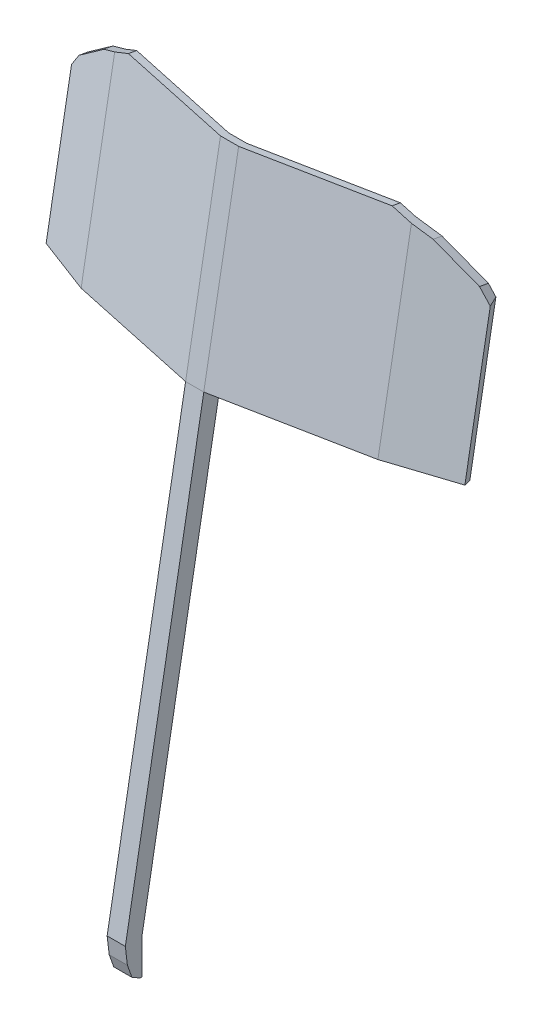
ISO-10303-21;
HEADER;
FILE_DESCRIPTION(('STEP AP214'),'2;1');
FILE_NAME('part.step','',(''),(''),'','','');
FILE_SCHEMA(('AUTOMOTIVE_DESIGN { 1 0 10303 214 1 1 1 1 }'));
ENDSEC;
DATA;
#1=APPLICATION_CONTEXT('core data for automotive mechanical design processes');
#2=APPLICATION_PROTOCOL_DEFINITION('international standard','automotive_design',2000,#1);
#3=PRODUCT_CONTEXT('',#1,'mechanical');
#4=PRODUCT('Part','Part','',(#3));
#5=PRODUCT_RELATED_PRODUCT_CATEGORY('part','',(#4));
#6=PRODUCT_DEFINITION_FORMATION('','',#4);
#7=PRODUCT_DEFINITION_CONTEXT('part definition',#1,'design');
#8=PRODUCT_DEFINITION('design','',#6,#7);
#9=PRODUCT_DEFINITION_SHAPE('','',#8);
#10=(LENGTH_UNIT() NAMED_UNIT(*) SI_UNIT(.MILLI.,.METRE.));
#11=(NAMED_UNIT(*) PLANE_ANGLE_UNIT() SI_UNIT($,.RADIAN.));
#12=(NAMED_UNIT(*) SI_UNIT($,.STERADIAN.) SOLID_ANGLE_UNIT());
#13=UNCERTAINTY_MEASURE_WITH_UNIT(LENGTH_MEASURE(1.E-05),#10,'distance_accuracy_value','');
#14=(GEOMETRIC_REPRESENTATION_CONTEXT(3) GLOBAL_UNCERTAINTY_ASSIGNED_CONTEXT((#13)) GLOBAL_UNIT_ASSIGNED_CONTEXT((#10,
#11,#12)) REPRESENTATION_CONTEXT('',''));
#15=CARTESIAN_POINT('',(0.,0.,0.));
#16=DIRECTION('',(0.,0.,1.));
#17=DIRECTION('',(1.,0.,0.));
#18=AXIS2_PLACEMENT_3D('',#15,#16,#17);
#19=CARTESIAN_POINT('',(-5.5,275.31648299456,-47.2745792244531));
#20=DIRECTION('',(0.,0.984436631052606,-0.175739919886731));
#21=DIRECTION('',(0.,0.175739919886731,0.984436631052606));
#22=AXIS2_PLACEMENT_3D('',#19,#20,#21);
#23=PLANE('',#22);
#24=DIRECTION('',(0.,0.175739919886731,0.984436631052606));
#25=VECTOR('',#24,1.);
#26=CARTESIAN_POINT('',(-5.5,275.31648299456,-47.2745792244531));
#27=LINE('',#26,#25);
#28=CARTESIAN_POINT('',(-5.5,275.31648299456,-47.2745792244531));
#29=VERTEX_POINT('',#28);
#30=CARTESIAN_POINT('',(-5.49999999999999,276.195182593994,-42.3523960691901));
#31=VERTEX_POINT('',#30);
#32=EDGE_CURVE('E384',#29,#31,#27,.T.);
#33=ORIENTED_EDGE('',*,*,#32,.T.);
#34=DIRECTION('',(1.,0.,0.));
#35=VECTOR('',#34,1.);
#36=CARTESIAN_POINT('',(-5.49999999999999,276.195182593994,-42.3523960691901));
#37=LINE('',#36,#35);
#38=CARTESIAN_POINT('',(5.5,276.195182593994,-42.3523960691901));
#39=VERTEX_POINT('',#38);
#40=EDGE_CURVE('E307',#31,#39,#37,.T.);
#41=ORIENTED_EDGE('',*,*,#40,.T.);
#42=DIRECTION('',(0.,0.175739919886731,0.984436631052606));
#43=VECTOR('',#42,1.);
#44=CARTESIAN_POINT('',(5.5,275.31648299456,-47.2745792244531));
#45=LINE('',#44,#43);
#46=CARTESIAN_POINT('',(5.5,275.31648299456,-47.2745792244531));
#47=VERTEX_POINT('',#46);
#48=EDGE_CURVE('E371',#47,#39,#45,.T.);
#49=ORIENTED_EDGE('',*,*,#48,.F.);
#50=DIRECTION('',(1.,0.,0.));
#51=VECTOR('',#50,1.);
#52=CARTESIAN_POINT('',(-5.5,275.31648299456,-47.2745792244531));
#53=LINE('',#52,#51);
#54=EDGE_CURVE('E392',#29,#47,#53,.T.);
#55=ORIENTED_EDGE('',*,*,#54,.F.);
#56=EDGE_LOOP('',(#33,#41,#49,#55));
#57=FACE_BOUND('',#56,.T.);
#58=ADVANCED_FACE('F47',(#57),#23,.T.);
#59=CARTESIAN_POINT('',(5.5,10.5,10.));
#60=DIRECTION('',(-1.,0.,0.));
#61=DIRECTION('',(0.,-1.,0.));
#62=AXIS2_PLACEMENT_3D('',#59,#60,#61);
#63=PLANE('',#62);
#64=DIRECTION('',(0.,0.993027798842381,0.117880408576895));
#65=VECTOR('',#64,1.);
#66=CARTESIAN_POINT('',(5.5,10.5,10.));
#67=LINE('',#66,#65);
#68=CARTESIAN_POINT('',(5.5,0.,8.75356531660011));
#69=VERTEX_POINT('',#68);
#70=CARTESIAN_POINT('',(5.5,10.5,10.));
#71=VERTEX_POINT('',#70);
#72=EDGE_CURVE('E410',#69,#71,#67,.T.);
#73=ORIENTED_EDGE('',*,*,#72,.F.);
#74=DIRECTION('',(0.,0.941962933262502,0.335716893169681));
#75=VECTOR('',#74,1.);
#76=CARTESIAN_POINT('',(5.5,9.71075237672118,12.2144909041513));
#77=LINE('',#76,#75);
#78=CARTESIAN_POINT('',(5.5,-7.69347784749952,6.01159916333903));
#79=VERTEX_POINT('',#78);
#80=EDGE_CURVE('E419',#79,#69,#77,.T.);
#81=ORIENTED_EDGE('',*,*,#80,.F.);
#82=DIRECTION('',(0.,0.495114424059408,0.868827777576385));
#83=VECTOR('',#82,1.);
#84=CARTESIAN_POINT('',(5.5,-1.51787268943564,16.8485633961284));
#85=LINE('',#84,#83);
#86=CARTESIAN_POINT('',(5.5,-10.5,1.08670849971477));
#87=VERTEX_POINT('',#86);
#88=EDGE_CURVE('E416',#87,#79,#85,.T.);
#89=ORIENTED_EDGE('',*,*,#88,.F.);
#90=DIRECTION('',(0.,0.,-1.));
#91=VECTOR('',#90,1.);
#92=CARTESIAN_POINT('',(5.5,-10.5,10.));
#93=LINE('',#92,#91);
#94=CARTESIAN_POINT('',(5.5,-10.5,0.));
#95=VERTEX_POINT('',#94);
#96=EDGE_CURVE('E466',#87,#95,#93,.T.);
#97=ORIENTED_EDGE('',*,*,#96,.T.);
#98=DIRECTION('',(0.,1.,0.));
#99=VECTOR('',#98,1.);
#100=CARTESIAN_POINT('',(5.5,10.5,0.));
#101=LINE('',#100,#99);
#102=CARTESIAN_POINT('',(5.5,10.5,0.));
#103=VERTEX_POINT('',#102);
#104=EDGE_CURVE('E462',#95,#103,#101,.T.);
#105=ORIENTED_EDGE('',*,*,#104,.T.);
#106=DIRECTION('',(0.,0.984436631052606,-0.175739919886732));
#107=VECTOR('',#106,1.);
#108=CARTESIAN_POINT('',(5.5,10.5,0.));
#109=LINE('',#108,#107);
#110=EDGE_CURVE('E366',#103,#47,#109,.T.);
#111=ORIENTED_EDGE('',*,*,#110,.T.);
#112=ORIENTED_EDGE('',*,*,#48,.T.);
#113=CARTESIAN_POINT('',(5.5,277.073882193427,-37.4302129139271));
#114=VERTEX_POINT('',#113);
#115=EDGE_CURVE('E370',#39,#114,#45,.T.);
#116=ORIENTED_EDGE('',*,*,#115,.T.);
#117=DIRECTION('',(0.,-0.984537484082691,0.175174034708699));
#118=VECTOR('',#117,1.);
#119=CARTESIAN_POINT('',(5.5,10.5,10.));
#120=LINE('',#119,#118);
#121=EDGE_CURVE('E375',#114,#71,#120,.T.);
#122=ORIENTED_EDGE('',*,*,#121,.T.);
#123=EDGE_LOOP('',(#73,#81,#89,#97,#105,#111,#112,#116,#122));
#124=FACE_BOUND('',#123,.T.);
#125=ADVANCED_FACE('F49',(#124),#63,.F.);
#126=CARTESIAN_POINT('',(-5.5,-10.5,10.));
#127=DIRECTION('',(1.,0.,0.));
#128=DIRECTION('',(0.,1.,0.));
#129=AXIS2_PLACEMENT_3D('',#126,#127,#128);
#130=PLANE('',#129);
#131=DIRECTION('',(0.,-0.993027798842381,-0.117880408576895));
#132=VECTOR('',#131,1.);
#133=CARTESIAN_POINT('',(-5.5,-10.2081883947486,7.54177102422916));
#134=LINE('',#133,#132);
#135=CARTESIAN_POINT('',(-5.5,10.5,10.));
#136=VERTEX_POINT('',#135);
#137=CARTESIAN_POINT('',(-5.5,0.,8.75356531660011));
#138=VERTEX_POINT('',#137);
#139=EDGE_CURVE('E407',#136,#138,#134,.T.);
#140=ORIENTED_EDGE('',*,*,#139,.F.);
#141=DIRECTION('',(0.,-0.984537484082691,0.175174034708699));
#142=VECTOR('',#141,1.);
#143=CARTESIAN_POINT('',(-5.5,10.5,10.));
#144=LINE('',#143,#142);
#145=CARTESIAN_POINT('',(-5.49999999999999,277.073882193427,-37.4302129139271));
#146=VERTEX_POINT('',#145);
#147=EDGE_CURVE('E388',#146,#136,#144,.T.);
#148=ORIENTED_EDGE('',*,*,#147,.F.);
#149=EDGE_CURVE('E383',#31,#146,#27,.T.);
#150=ORIENTED_EDGE('',*,*,#149,.F.);
#151=ORIENTED_EDGE('',*,*,#32,.F.);
#152=DIRECTION('',(0.,0.984436631052606,-0.175739919886732));
#153=VECTOR('',#152,1.);
#154=CARTESIAN_POINT('',(-5.5,10.5,0.));
#155=LINE('',#154,#153);
#156=CARTESIAN_POINT('',(-5.5,10.5,0.));
#157=VERTEX_POINT('',#156);
#158=EDGE_CURVE('E379',#157,#29,#155,.T.);
#159=ORIENTED_EDGE('',*,*,#158,.F.);
#160=DIRECTION('',(0.,-1.,0.));
#161=VECTOR('',#160,1.);
#162=CARTESIAN_POINT('',(-5.5,-10.5,0.));
#163=LINE('',#162,#161);
#164=CARTESIAN_POINT('',(-5.5,-10.5,0.));
#165=VERTEX_POINT('',#164);
#166=EDGE_CURVE('E474',#157,#165,#163,.T.);
#167=ORIENTED_EDGE('',*,*,#166,.T.);
#168=DIRECTION('',(0.,0.,-1.));
#169=VECTOR('',#168,1.);
#170=CARTESIAN_POINT('',(-5.5,-10.5,10.));
#171=LINE('',#170,#169);
#172=CARTESIAN_POINT('',(-5.5,-10.5,1.08670849971477));
#173=VERTEX_POINT('',#172);
#174=EDGE_CURVE('E483',#173,#165,#171,.T.);
#175=ORIENTED_EDGE('',*,*,#174,.F.);
#176=DIRECTION('',(0.,-0.495114424059408,-0.868827777576385));
#177=VECTOR('',#176,1.);
#178=CARTESIAN_POINT('',(-5.5,-6.6657768405809,7.8150109373959));
#179=LINE('',#178,#177);
#180=CARTESIAN_POINT('',(-5.5,-7.69347784749952,6.01159916333903));
#181=VERTEX_POINT('',#180);
#182=EDGE_CURVE('E413',#181,#173,#179,.T.);
#183=ORIENTED_EDGE('',*,*,#182,.F.);
#184=DIRECTION('',(0.,-0.941962933262502,-0.335716893169681));
#185=VECTOR('',#184,1.);
#186=CARTESIAN_POINT('',(-5.5,-8.92242514372926,5.57360064599764));
#187=LINE('',#186,#185);
#188=EDGE_CURVE('E246',#138,#181,#187,.T.);
#189=ORIENTED_EDGE('',*,*,#188,.F.);
#190=EDGE_LOOP('',(#140,#148,#150,#151,#159,#167,#175,#183,#189));
#191=FACE_BOUND('',#190,.T.);
#192=ADVANCED_FACE('F633',(#191),#130,.F.);
#193=CARTESIAN_POINT('',(5.5,-10.5,10.));
#194=DIRECTION('',(0.,1.,0.));
#195=DIRECTION('',(0.,0.,1.));
#196=AXIS2_PLACEMENT_3D('',#193,#194,#195);
#197=PLANE('',#196);
#198=DIRECTION('',(1.,0.,0.));
#199=VECTOR('',#198,1.);
#200=CARTESIAN_POINT('',(5.5,-10.5,1.08670849971477));
#201=LINE('',#200,#199);
#202=EDGE_CURVE('E486',#173,#87,#201,.T.);
#203=ORIENTED_EDGE('',*,*,#202,.F.);
#204=ORIENTED_EDGE('',*,*,#174,.T.);
#205=DIRECTION('',(1.,0.,0.));
#206=VECTOR('',#205,1.);
#207=CARTESIAN_POINT('',(5.5,-10.5,0.));
#208=LINE('',#207,#206);
#209=EDGE_CURVE('E467',#165,#95,#208,.T.);
#210=ORIENTED_EDGE('',*,*,#209,.T.);
#211=ORIENTED_EDGE('',*,*,#96,.F.);
#212=EDGE_LOOP('',(#203,#204,#210,#211));
#213=FACE_BOUND('',#212,.T.);
#214=ADVANCED_FACE('F646',(#213),#197,.F.);
#215=CARTESIAN_POINT('',(0.,0.,0.));
#216=DIRECTION('',(0.,0.,-1.));
#217=DIRECTION('',(-1.,0.,0.));
#218=AXIS2_PLACEMENT_3D('',#215,#216,#217);
#219=PLANE('',#218);
#220=ORIENTED_EDGE('',*,*,#104,.F.);
#221=ORIENTED_EDGE('',*,*,#209,.F.);
#222=ORIENTED_EDGE('',*,*,#166,.F.);
#223=DIRECTION('',(-1.,0.,0.));
#224=VECTOR('',#223,1.);
#225=CARTESIAN_POINT('',(-5.5,10.5,0.));
#226=LINE('',#225,#224);
#227=EDGE_CURVE('E470',#103,#157,#226,.T.);
#228=ORIENTED_EDGE('',*,*,#227,.F.);
#229=EDGE_LOOP('',(#220,#221,#222,#228));
#230=FACE_BOUND('',#229,.T.);
#231=DIRECTION('',(0.,1.,0.));
#232=VECTOR('',#231,1.);
#233=CARTESIAN_POINT('',(2.,-1.5,0.));
#234=LINE('',#233,#232);
#235=CARTESIAN_POINT('',(2.,-1.5,0.));
#236=VERTEX_POINT('',#235);
#237=CARTESIAN_POINT('',(2.,1.5,0.));
#238=VERTEX_POINT('',#237);
#239=EDGE_CURVE('E427',#236,#238,#234,.T.);
#240=ORIENTED_EDGE('',*,*,#239,.T.);
#241=DIRECTION('',(-1.,0.,0.));
#242=VECTOR('',#241,1.);
#243=CARTESIAN_POINT('',(0.,1.5,0.));
#244=LINE('',#243,#242);
#245=CARTESIAN_POINT('',(-2.,1.5,0.));
#246=VERTEX_POINT('',#245);
#247=EDGE_CURVE('E422',#238,#246,#244,.T.);
#248=ORIENTED_EDGE('',*,*,#247,.T.);
#249=DIRECTION('',(0.,-1.,0.));
#250=VECTOR('',#249,1.);
#251=CARTESIAN_POINT('',(-2.,1.5,0.));
#252=LINE('',#251,#250);
#253=CARTESIAN_POINT('',(-2.,-1.5,0.));
#254=VERTEX_POINT('',#253);
#255=EDGE_CURVE('E440',#246,#254,#252,.T.);
#256=ORIENTED_EDGE('',*,*,#255,.T.);
#257=DIRECTION('',(1.,0.,0.));
#258=VECTOR('',#257,1.);
#259=CARTESIAN_POINT('',(-2.,-1.5,0.));
#260=LINE('',#259,#258);
#261=EDGE_CURVE('E444',#254,#236,#260,.T.);
#262=ORIENTED_EDGE('',*,*,#261,.T.);
#263=EDGE_LOOP('',(#240,#248,#256,#262));
#264=FACE_BOUND('',#263,.T.);
#265=ADVANCED_FACE('F651',(#230,#264),#219,.T.);
#266=CARTESIAN_POINT('',(0.,1.5,8.));
#267=DIRECTION('',(0.,-1.,0.));
#268=DIRECTION('',(1.,0.,0.));
#269=AXIS2_PLACEMENT_3D('',#266,#267,#268);
#270=PLANE('',#269);
#271=ORIENTED_EDGE('',*,*,#247,.F.);
#272=DIRECTION('',(0.,0.,-1.));
#273=VECTOR('',#272,1.);
#274=CARTESIAN_POINT('',(2.,1.5,8.));
#275=LINE('',#274,#273);
#276=CARTESIAN_POINT('',(2.,1.5,8.));
#277=VERTEX_POINT('',#276);
#278=EDGE_CURVE('E436',#277,#238,#275,.T.);
#279=ORIENTED_EDGE('',*,*,#278,.F.);
#280=DIRECTION('',(-1.,0.,0.));
#281=VECTOR('',#280,1.);
#282=CARTESIAN_POINT('',(2.,1.5,8.));
#283=LINE('',#282,#281);
#284=CARTESIAN_POINT('',(-2.,1.5,8.));
#285=VERTEX_POINT('',#284);
#286=EDGE_CURVE('E423',#277,#285,#283,.T.);
#287=ORIENTED_EDGE('',*,*,#286,.T.);
#288=DIRECTION('',(0.,0.,-1.));
#289=VECTOR('',#288,1.);
#290=CARTESIAN_POINT('',(-2.,1.5,8.));
#291=LINE('',#290,#289);
#292=EDGE_CURVE('E459',#285,#246,#291,.T.);
#293=ORIENTED_EDGE('',*,*,#292,.T.);
#294=EDGE_LOOP('',(#271,#279,#287,#293));
#295=FACE_BOUND('',#294,.T.);
#296=ADVANCED_FACE('F915',(#295),#270,.T.);
#297=CARTESIAN_POINT('',(-2.,1.5,8.));
#298=DIRECTION('',(1.,0.,0.));
#299=DIRECTION('',(0.,1.,0.));
#300=AXIS2_PLACEMENT_3D('',#297,#298,#299);
#301=PLANE('',#300);
#302=ORIENTED_EDGE('',*,*,#255,.F.);
#303=ORIENTED_EDGE('',*,*,#292,.F.);
#304=DIRECTION('',(0.,-1.,0.));
#305=VECTOR('',#304,1.);
#306=CARTESIAN_POINT('',(-2.,1.5,8.));
#307=LINE('',#306,#305);
#308=CARTESIAN_POINT('',(-2.,-1.5,8.));
#309=VERTEX_POINT('',#308);
#310=EDGE_CURVE('E426',#285,#309,#307,.T.);
#311=ORIENTED_EDGE('',*,*,#310,.T.);
#312=DIRECTION('',(0.,0.,-1.));
#313=VECTOR('',#312,1.);
#314=CARTESIAN_POINT('',(-2.,-1.5,8.));
#315=LINE('',#314,#313);
#316=EDGE_CURVE('E456',#309,#254,#315,.T.);
#317=ORIENTED_EDGE('',*,*,#316,.T.);
#318=EDGE_LOOP('',(#302,#303,#311,#317));
#319=FACE_BOUND('',#318,.T.);
#320=ADVANCED_FACE('F906',(#319),#301,.T.);
#321=CARTESIAN_POINT('',(-2.,-1.5,8.));
#322=DIRECTION('',(0.,1.,0.));
#323=DIRECTION('',(0.,0.,1.));
#324=AXIS2_PLACEMENT_3D('',#321,#322,#323);
#325=PLANE('',#324);
#326=ORIENTED_EDGE('',*,*,#261,.F.);
#327=ORIENTED_EDGE('',*,*,#316,.F.);
#328=DIRECTION('',(1.,0.,0.));
#329=VECTOR('',#328,1.);
#330=CARTESIAN_POINT('',(-2.,-1.5,8.));
#331=LINE('',#330,#329);
#332=CARTESIAN_POINT('',(2.,-1.5,8.));
#333=VERTEX_POINT('',#332);
#334=EDGE_CURVE('E430',#309,#333,#331,.T.);
#335=ORIENTED_EDGE('',*,*,#334,.T.);
#336=DIRECTION('',(0.,0.,-1.));
#337=VECTOR('',#336,1.);
#338=CARTESIAN_POINT('',(2.,-1.5,8.));
#339=LINE('',#338,#337);
#340=EDGE_CURVE('E453',#333,#236,#339,.T.);
#341=ORIENTED_EDGE('',*,*,#340,.T.);
#342=EDGE_LOOP('',(#326,#327,#335,#341));
#343=FACE_BOUND('',#342,.T.);
#344=ADVANCED_FACE('F897',(#343),#325,.T.);
#345=CARTESIAN_POINT('',(2.,-1.5,8.));
#346=DIRECTION('',(-1.,0.,0.));
#347=DIRECTION('',(0.,-1.,0.));
#348=AXIS2_PLACEMENT_3D('',#345,#346,#347);
#349=PLANE('',#348);
#350=ORIENTED_EDGE('',*,*,#239,.F.);
#351=ORIENTED_EDGE('',*,*,#340,.F.);
#352=DIRECTION('',(0.,1.,0.));
#353=VECTOR('',#352,1.);
#354=CARTESIAN_POINT('',(2.,-1.5,8.));
#355=LINE('',#354,#353);
#356=EDGE_CURVE('E433',#333,#277,#355,.T.);
#357=ORIENTED_EDGE('',*,*,#356,.T.);
#358=ORIENTED_EDGE('',*,*,#278,.T.);
#359=EDGE_LOOP('',(#350,#351,#357,#358));
#360=FACE_BOUND('',#359,.T.);
#361=ADVANCED_FACE('F888',(#360),#349,.T.);
#362=CARTESIAN_POINT('',(0.,0.,8.));
#363=DIRECTION('',(0.,0.,1.));
#364=DIRECTION('',(1.,0.,0.));
#365=AXIS2_PLACEMENT_3D('',#362,#363,#364);
#366=PLANE('',#365);
#367=ORIENTED_EDGE('',*,*,#286,.F.);
#368=ORIENTED_EDGE('',*,*,#356,.F.);
#369=ORIENTED_EDGE('',*,*,#334,.F.);
#370=ORIENTED_EDGE('',*,*,#310,.F.);
#371=EDGE_LOOP('',(#367,#368,#369,#370));
#372=FACE_BOUND('',#371,.T.);
#373=ADVANCED_FACE('F858',(#372),#366,.F.);
#374=CARTESIAN_POINT('',(8.,-7.69347784749952,6.01159916333903));
#375=DIRECTION('',(0.,-0.335716893169681,0.941962933262502));
#376=DIRECTION('',(0.,-0.941962933262502,-0.335716893169681));
#377=AXIS2_PLACEMENT_3D('',#374,#375,#376);
#378=PLANE('',#377);
#379=ORIENTED_EDGE('',*,*,#80,.T.);
#380=DIRECTION('',(-1.,0.,0.));
#381=VECTOR('',#380,1.);
#382=CARTESIAN_POINT('',(8.,0.,8.75356531660011));
#383=LINE('',#382,#381);
#384=EDGE_CURVE('E397',#69,#138,#383,.T.);
#385=ORIENTED_EDGE('',*,*,#384,.T.);
#386=ORIENTED_EDGE('',*,*,#188,.T.);
#387=DIRECTION('',(-1.,0.,0.));
#388=VECTOR('',#387,1.);
#389=CARTESIAN_POINT('',(8.,-7.69347784749952,6.01159916333903));
#390=LINE('',#389,#388);
#391=EDGE_CURVE('E403',#79,#181,#390,.T.);
#392=ORIENTED_EDGE('',*,*,#391,.F.);
#393=EDGE_LOOP('',(#379,#385,#386,#392));
#394=FACE_BOUND('',#393,.T.);
#395=ADVANCED_FACE('F638',(#394),#378,.T.);
#396=CARTESIAN_POINT('',(8.,-10.5,1.08670849971477));
#397=DIRECTION('',(0.,-0.868827777576385,0.495114424059408));
#398=DIRECTION('',(0.,-0.495114424059408,-0.868827777576385));
#399=AXIS2_PLACEMENT_3D('',#396,#397,#398);
#400=PLANE('',#399);
#401=ORIENTED_EDGE('',*,*,#88,.T.);
#402=ORIENTED_EDGE('',*,*,#391,.T.);
#403=ORIENTED_EDGE('',*,*,#182,.T.);
#404=ORIENTED_EDGE('',*,*,#202,.T.);
#405=EDGE_LOOP('',(#401,#402,#403,#404));
#406=FACE_BOUND('',#405,.T.);
#407=ADVANCED_FACE('F641',(#406),#400,.T.);
#408=CARTESIAN_POINT('',(8.,0.,8.75356531660011));
#409=DIRECTION('',(0.,-0.117880408576895,0.993027798842381));
#410=DIRECTION('',(0.,-0.993027798842381,-0.117880408576895));
#411=AXIS2_PLACEMENT_3D('',#408,#409,#410);
#412=PLANE('',#411);
#413=ORIENTED_EDGE('',*,*,#72,.T.);
#414=DIRECTION('',(-1.,0.,0.));
#415=VECTOR('',#414,1.);
#416=CARTESIAN_POINT('',(-5.5,10.5,10.));
#417=LINE('',#416,#415);
#418=EDGE_CURVE('E463',#71,#136,#417,.T.);
#419=ORIENTED_EDGE('',*,*,#418,.T.);
#420=ORIENTED_EDGE('',*,*,#139,.T.);
#421=ORIENTED_EDGE('',*,*,#384,.F.);
#422=EDGE_LOOP('',(#413,#419,#420,#421));
#423=FACE_BOUND('',#422,.T.);
#424=ADVANCED_FACE('F629',(#423),#412,.T.);
#425=CARTESIAN_POINT('',(-5.5,10.5,10.));
#426=DIRECTION('',(0.,0.175174034708699,0.984537484082691));
#427=DIRECTION('',(0.,-0.984537484082691,0.175174034708699));
#428=AXIS2_PLACEMENT_3D('',#425,#426,#427);
#429=PLANE('',#428);
#430=ORIENTED_EDGE('',*,*,#418,.F.);
#431=ORIENTED_EDGE('',*,*,#121,.F.);
#432=DIRECTION('',(1.,0.,0.));
#433=VECTOR('',#432,1.);
#434=CARTESIAN_POINT('',(-5.5,277.073882193427,-37.4302129139271));
#435=LINE('',#434,#433);
#436=EDGE_CURVE('E393',#146,#114,#435,.T.);
#437=ORIENTED_EDGE('',*,*,#436,.F.);
#438=ORIENTED_EDGE('',*,*,#147,.T.);
#439=EDGE_LOOP('',(#430,#431,#437,#438));
#440=FACE_BOUND('',#439,.T.);
#441=ADVANCED_FACE('F626',(#440),#429,.T.);
#442=CARTESIAN_POINT('',(-5.5,10.5,0.));
#443=DIRECTION('',(0.,-0.175739919886732,-0.984436631052606));
#444=DIRECTION('',(0.,0.984436631052606,-0.175739919886732));
#445=AXIS2_PLACEMENT_3D('',#442,#443,#444);
#446=PLANE('',#445);
#447=ORIENTED_EDGE('',*,*,#54,.T.);
#448=ORIENTED_EDGE('',*,*,#110,.F.);
#449=ORIENTED_EDGE('',*,*,#227,.T.);
#450=ORIENTED_EDGE('',*,*,#158,.T.);
#451=EDGE_LOOP('',(#447,#448,#449,#450));
#452=FACE_BOUND('',#451,.T.);
#453=ADVANCED_FACE('F658',(#452),#446,.T.);
#454=CARTESIAN_POINT('',(0.,274.992195540421,-49.091129778537));
#455=DIRECTION('',(0.,0.984436631052607,-0.175739919886729));
#456=DIRECTION('',(0.,0.175739919886729,0.984436631052607));
#457=AXIS2_PLACEMENT_3D('',#454,#455,#456);
#458=PLANE('',#457);
#459=DIRECTION('',(-0.969016833125615,-0.0434068271152302,-0.243150620971842));
#460=VECTOR('',#459,1.);
#461=CARTESIAN_POINT('',(-5.49999999999999,276.195182593994,-42.3523960691901));
#462=LINE('',#461,#460);
#463=CARTESIAN_POINT('',(-87.6520205536125,272.515206734508,-62.9663979408304));
#464=VERTEX_POINT('',#463);
#465=EDGE_CURVE('E311',#31,#464,#462,.T.);
#466=ORIENTED_EDGE('',*,*,#465,.F.);
#467=ORIENTED_EDGE('',*,*,#149,.T.);
#468=DIRECTION('',(-0.969233859352783,-0.0432569188565593,-0.242310884722799));
#469=VECTOR('',#468,1.);
#470=CARTESIAN_POINT('',(-5.49999999999999,277.073882193427,-37.4302129139271));
#471=LINE('',#470,#469);
#472=CARTESIAN_POINT('',(-89.7224246344539,273.315034364124,-58.4860293505314));
#473=VERTEX_POINT('',#472);
#474=EDGE_CURVE('E271',#146,#473,#471,.T.);
#475=ORIENTED_EDGE('',*,*,#474,.T.);
#476=DIRECTION('',(0.917702741985329,0.0698158052487646,0.391084940505354));
#477=VECTOR('',#476,1.);
#478=CARTESIAN_POINT('',(-126.598918960081,270.509592004297,-74.2011851734115));
#479=LINE('',#478,#477);
#480=CARTESIAN_POINT('',(-126.598918960081,270.509592004297,-74.2011851734115));
#481=VERTEX_POINT('',#480);
#482=EDGE_CURVE('E323',#481,#473,#479,.T.);
#483=ORIENTED_EDGE('',*,*,#482,.F.);
#484=DIRECTION('',(0.331880735474261,-0.165779219226783,-0.928640095997164));
#485=VECTOR('',#484,1.);
#486=CARTESIAN_POINT('',(-126.598918960081,270.509592004297,-74.2011851734115));
#487=LINE('',#486,#485);
#488=CARTESIAN_POINT('',(-124.938057952393,269.679967950629,-78.848463429598));
#489=VERTEX_POINT('',#488);
#490=EDGE_CURVE('E319',#481,#489,#487,.T.);
#491=ORIENTED_EDGE('',*,*,#490,.T.);
#492=DIRECTION('',(0.917772186758867,0.0697876063051302,0.390926979393911));
#493=VECTOR('',#492,1.);
#494=CARTESIAN_POINT('',(-124.938057952393,269.679967950629,-78.848463429598));
#495=LINE('',#494,#493);
#496=EDGE_CURVE('E315',#489,#464,#495,.T.);
#497=ORIENTED_EDGE('',*,*,#496,.T.);
#498=EDGE_LOOP('',(#466,#467,#475,#483,#491,#497));
#499=FACE_BOUND('',#498,.T.);
#500=ADVANCED_FACE('F660',(#499),#458,.F.);
#501=CARTESIAN_POINT('',(-5.49999999999999,395.20627791974,-58.5190033003347));
#502=DIRECTION('',(0.,-0.175739919886731,-0.984436631052606));
#503=DIRECTION('',(0.,0.984436631052606,-0.175739919886731));
#504=AXIS2_PLACEMENT_3D('',#501,#502,#503);
#505=PLANE('',#504);
#506=ORIENTED_EDGE('',*,*,#436,.T.);
#507=DIRECTION('',(0.,-0.984436631052606,0.175739919886731));
#508=VECTOR('',#507,1.);
#509=CARTESIAN_POINT('',(5.5,395.20627791974,-58.5190033003347));
#510=LINE('',#509,#508);
#511=CARTESIAN_POINT('',(5.5,395.20627791974,-58.5190033003347));
#512=VERTEX_POINT('',#511);
#513=EDGE_CURVE('E363',#512,#114,#510,.T.);
#514=ORIENTED_EDGE('',*,*,#513,.F.);
#515=DIRECTION('',(1.,0.,0.));
#516=VECTOR('',#515,1.);
#517=CARTESIAN_POINT('',(-5.49999999999999,395.20627791974,-58.5190033003347));
#518=LINE('',#517,#516);
#519=CARTESIAN_POINT('',(-5.49999999999999,395.20627791974,-58.5190033003347));
#520=VERTEX_POINT('',#519);
#521=EDGE_CURVE('E262',#520,#512,#518,.T.);
#522=ORIENTED_EDGE('',*,*,#521,.F.);
#523=DIRECTION('',(0.,-0.984436631052606,0.175739919886731));
#524=VECTOR('',#523,1.);
#525=CARTESIAN_POINT('',(-5.49999999999999,395.20627791974,-58.5190033003347));
#526=LINE('',#525,#524);
#527=EDGE_CURVE('E286',#520,#146,#526,.T.);
#528=ORIENTED_EDGE('',*,*,#527,.T.);
#529=EDGE_LOOP('',(#506,#514,#522,#528));
#530=FACE_BOUND('',#529,.T.);
#531=ADVANCED_FACE('F616',(#530),#505,.F.);
#532=CARTESIAN_POINT('',(5.5,395.20627791974,-58.5190033003347));
#533=DIRECTION('',(-0.246141678478288,-0.170333080794165,-0.95414931520337));
#534=DIRECTION('',(-0.968299517353845,0.,0.249792002858998));
#535=AXIS2_PLACEMENT_3D('',#532,#533,#534);
#536=PLANE('',#535);
#537=DIRECTION('',(0.,-0.984436631052606,0.175739919886731));
#538=VECTOR('',#537,1.);
#539=CARTESIAN_POINT('',(89.7224246344539,391.447430090437,-79.5748197369391));
#540=LINE('',#539,#538);
#541=CARTESIAN_POINT('',(89.7224246344539,386.905495998697,-78.7640015407899));
#542=VERTEX_POINT('',#541);
#543=CARTESIAN_POINT('',(89.7224246344539,273.315034364124,-58.4860293505314));
#544=VERTEX_POINT('',#543);
#545=EDGE_CURVE('E255',#542,#544,#540,.T.);
#546=ORIENTED_EDGE('',*,*,#545,.F.);
#547=DIRECTION('',(-0.884796739810796,0.441357336871688,0.149460464370074));
#548=VECTOR('',#547,1.);
#549=CARTESIAN_POINT('',(17.8688205745504,422.747756605684,-66.6264420921045));
#550=LINE('',#549,#548);
#551=CARTESIAN_POINT('',(79.7224246344539,391.893730211292,-77.0747947699555));
#552=VERTEX_POINT('',#551);
#553=EDGE_CURVE('E238',#542,#552,#550,.T.);
#554=ORIENTED_EDGE('',*,*,#553,.T.);
#555=DIRECTION('',(0.969233859352783,-0.04325691885656,-0.2423108847228));
#556=VECTOR('',#555,1.);
#557=CARTESIAN_POINT('',(5.5,395.20627791974,-58.5190033003347));
#558=LINE('',#557,#556);
#559=EDGE_CURVE('E252',#512,#552,#558,.T.);
#560=ORIENTED_EDGE('',*,*,#559,.F.);
#561=ORIENTED_EDGE('',*,*,#513,.T.);
#562=DIRECTION('',(0.969233859352783,-0.04325691885656,-0.2423108847228));
#563=VECTOR('',#562,1.);
#564=CARTESIAN_POINT('',(5.5,277.073882193427,-37.4302129139271));
#565=LINE('',#564,#563);
#566=EDGE_CURVE('E287',#114,#544,#565,.T.);
#567=ORIENTED_EDGE('',*,*,#566,.T.);
#568=EDGE_LOOP('',(#546,#554,#560,#561,#567));
#569=FACE_BOUND('',#568,.T.);
#570=ADVANCED_FACE('F250',(#569),#536,.F.);
#571=CARTESIAN_POINT('',(89.7224246344539,391.447430090437,-79.5748197369391));
#572=DIRECTION('',(-0.397267765307745,-0.161277006356335,-0.903420195627776));
#573=DIRECTION('',(-0.915403580212415,0.,0.402537309245109));
#574=AXIS2_PLACEMENT_3D('',#571,#572,#573);
#575=PLANE('',#574);
#576=DIRECTION('',(0.,-0.984436631052606,0.175739919886731));
#577=VECTOR('',#576,1.);
#578=CARTESIAN_POINT('',(126.598918960081,388.64198773061,-95.2899755598192));
#579=LINE('',#578,#577);
#580=CARTESIAN_POINT('',(126.598918960081,356.540257633964,-89.5592303828769));
#581=VERTEX_POINT('',#580);
#582=CARTESIAN_POINT('',(126.598918960081,270.509592004297,-74.2011851734115));
#583=VERTEX_POINT('',#582);
#584=EDGE_CURVE('E358',#581,#583,#579,.T.);
#585=ORIENTED_EDGE('',*,*,#584,.F.);
#586=DIRECTION('',(-0.562634813118957,0.820520845772363,0.100933684761841));
#587=VECTOR('',#586,1.);
#588=CARTESIAN_POINT('',(98.2433478184076,397.892724052719,-84.4723921494055));
#589=LINE('',#588,#587);
#590=CARTESIAN_POINT('',(121.100925347477,364.558279739736,-88.5729196513371));
#591=VERTEX_POINT('',#590);
#592=EDGE_CURVE('E291',#581,#591,#589,.T.);
#593=ORIENTED_EDGE('',*,*,#592,.T.);
#594=DIRECTION('',(-0.762569464887439,0.605695238420864,0.227202749489478));
#595=VECTOR('',#594,1.);
#596=CARTESIAN_POINT('',(88.8752660326097,390.154542507574,-78.9714882571103));
#597=LINE('',#596,#595);
#598=CARTESIAN_POINT('',(99.4801792196208,381.731250313219,-82.131155074535));
#599=VERTEX_POINT('',#598);
#600=EDGE_CURVE('E552',#591,#599,#597,.T.);
#601=ORIENTED_EDGE('',*,*,#600,.T.);
#602=DIRECTION('',(-0.845074912543345,0.448117974475354,0.2916139110913));
#603=VECTOR('',#602,1.);
#604=CARTESIAN_POINT('',(88.2022392842208,387.711604865334,-78.2394241465433));
#605=LINE('',#604,#603);
#606=EDGE_CURVE('E257',#599,#542,#605,.T.);
#607=ORIENTED_EDGE('',*,*,#606,.T.);
#608=ORIENTED_EDGE('',*,*,#545,.T.);
#609=DIRECTION('',(0.917702741985329,-0.0698158052487633,-0.391084940505354));
#610=VECTOR('',#609,1.);
#611=CARTESIAN_POINT('',(89.7224246344539,273.315034364124,-58.4860293505314));
#612=LINE('',#611,#610);
#613=EDGE_CURVE('E290',#544,#583,#612,.T.);
#614=ORIENTED_EDGE('',*,*,#613,.T.);
#615=EDGE_LOOP('',(#585,#593,#601,#607,#608,#614));
#616=FACE_BOUND('',#615,.T.);
#617=ADVANCED_FACE('F562',(#616),#575,.F.);
#618=CARTESIAN_POINT('',(126.598918960081,388.64198773061,-95.2899755598192));
#619=DIRECTION('',(-0.943321354269617,0.0583246938641958,0.326715553141543));
#620=DIRECTION('',(0.327272680529176,0.,0.944929940566626));
#621=AXIS2_PLACEMENT_3D('',#618,#619,#620);
#622=PLANE('',#621);
#623=DIRECTION('',(0.,-0.984436631052606,0.175739919886731));
#624=VECTOR('',#623,1.);
#625=CARTESIAN_POINT('',(124.938057952393,387.812363676942,-99.9372538160057));
#626=LINE('',#625,#624);
#627=CARTESIAN_POINT('',(124.938057952393,358.006404374295,-94.6163456592325));
#628=VERTEX_POINT('',#627);
#629=CARTESIAN_POINT('',(124.938057952393,269.679967950629,-78.848463429598));
#630=VERTEX_POINT('',#629);
#631=EDGE_CURVE('E355',#628,#630,#626,.T.);
#632=ORIENTED_EDGE('',*,*,#631,.F.);
#633=DIRECTION('',(0.300821089323764,-0.265553744409371,0.915962816411358));
#634=VECTOR('',#633,1.);
#635=CARTESIAN_POINT('',(122.455444134404,360.197964137514,-102.175596075813));
#636=LINE('',#635,#634);
#637=EDGE_CURVE('E555',#628,#581,#636,.T.);
#638=ORIENTED_EDGE('',*,*,#637,.T.);
#639=ORIENTED_EDGE('',*,*,#584,.T.);
#640=DIRECTION('',(-0.331880735474261,-0.165779219226783,-0.928640095997164));
#641=VECTOR('',#640,1.);
#642=CARTESIAN_POINT('',(126.598918960081,270.509592004297,-74.2011851734115));
#643=LINE('',#642,#641);
#644=EDGE_CURVE('E295',#583,#630,#643,.T.);
#645=ORIENTED_EDGE('',*,*,#644,.T.);
#646=EDGE_LOOP('',(#632,#638,#639,#645));
#647=FACE_BOUND('',#646,.T.);
#648=ADVANCED_FACE('F567',(#647),#622,.F.);
#649=CARTESIAN_POINT('',(87.6520205536125,390.647602460821,-84.0551883272381));
#650=DIRECTION('',(-0.397107306923264,-0.161289210575273,-0.903488559606683));
#651=DIRECTION('',(-0.915474701086161,0.,0.402375535627111));
#652=AXIS2_PLACEMENT_3D('',#649,#650,#651);
#653=PLANE('',#652);
#654=DIRECTION('',(-0.562650815422862,0.820523656228539,0.100821572460163));
#655=VECTOR('',#654,1.);
#656=CARTESIAN_POINT('',(97.46568267879,398.069856140269,-89.6935622945292));
#657=LINE('',#656,#655);
#658=CARTESIAN_POINT('',(121.100925347477,363.602162859162,-93.9287686890025));
#659=VERTEX_POINT('',#658);
#660=EDGE_CURVE('E11',#628,#659,#657,.T.);
#661=ORIENTED_EDGE('',*,*,#660,.F.);
#662=ORIENTED_EDGE('',*,*,#631,.T.);
#663=DIRECTION('',(0.917772186758867,-0.0697876063051302,-0.390926979393911));
#664=VECTOR('',#663,1.);
#665=CARTESIAN_POINT('',(87.6520205536125,272.515206734508,-62.9663979408304));
#666=LINE('',#665,#664);
#667=CARTESIAN_POINT('',(87.6520205536125,272.515206734508,-62.9663979408304));
#668=VERTEX_POINT('',#667);
#669=EDGE_CURVE('E299',#668,#630,#666,.T.);
#670=ORIENTED_EDGE('',*,*,#669,.F.);
#671=DIRECTION('',(0.,-0.984436631052606,0.175739919886731));
#672=VECTOR('',#671,1.);
#673=CARTESIAN_POINT('',(87.6520205536125,390.647602460821,-84.0551883272381));
#674=LINE('',#673,#672);
#675=CARTESIAN_POINT('',(87.6520205536125,387.046032256926,-83.4122422613017));
#676=VERTEX_POINT('',#675);
#677=EDGE_CURVE('E352',#676,#668,#674,.T.);
#678=ORIENTED_EDGE('',*,*,#677,.F.);
#679=DIRECTION('',(-0.845129139047991,0.448115897253338,0.29145991312844));
#680=VECTOR('',#679,1.);
#681=CARTESIAN_POINT('',(86.4464202923795,387.68528206838,-82.996466575467));
#682=LINE('',#681,#680);
#683=CARTESIAN_POINT('',(99.4801792196208,380.774344666738,-87.4914225166975));
#684=VERTEX_POINT('',#683);
#685=EDGE_CURVE('E514',#684,#676,#682,.T.);
#686=ORIENTED_EDGE('',*,*,#685,.F.);
#687=DIRECTION('',(-0.76260930829312,0.605699063885996,0.227058774136384));
#688=VECTOR('',#687,1.);
#689=CARTESIAN_POINT('',(87.4456598128339,390.332708378982,-83.9082729352407));
#690=LINE('',#689,#688);
#691=EDGE_CURVE('E56',#659,#684,#690,.T.);
#692=ORIENTED_EDGE('',*,*,#691,.F.);
#693=EDGE_LOOP('',(#661,#662,#670,#678,#686,#692));
#694=FACE_BOUND('',#693,.T.);
#695=ADVANCED_FACE('F519',(#694),#653,.T.);
#696=CARTESIAN_POINT('',(5.5,394.327578320306,-63.4411864555978));
#697=DIRECTION('',(-0.246994690467637,-0.170294940622389,-0.953935666635446));
#698=DIRECTION('',(-0.968076224026532,0.,0.250655988307742));
#699=AXIS2_PLACEMENT_3D('',#696,#697,#698);
#700=PLANE('',#699);
#701=DIRECTION('',(-0.884631626784811,0.441420670780707,0.150248714801724));
#702=VECTOR('',#701,1.);
#703=CARTESIAN_POINT('',(17.864204683132,421.869323173882,-71.559252467721));
#704=LINE('',#703,#702);
#705=CARTESIAN_POINT('',(79.7224246344546,391.002806402992,-82.0654538810574));
#706=VERTEX_POINT('',#705);
#707=EDGE_CURVE('E71',#676,#706,#704,.T.);
#708=ORIENTED_EDGE('',*,*,#707,.F.);
#709=ORIENTED_EDGE('',*,*,#677,.T.);
#710=DIRECTION('',(0.969016833125615,-0.0434068271152302,-0.243150620971842));
#711=VECTOR('',#710,1.);
#712=CARTESIAN_POINT('',(5.5,276.195182593994,-42.3523960691901));
#713=LINE('',#712,#711);
#714=EDGE_CURVE('E303',#39,#668,#713,.T.);
#715=ORIENTED_EDGE('',*,*,#714,.F.);
#716=DIRECTION('',(0.,-0.984436631052606,0.175739919886731));
#717=VECTOR('',#716,1.);
#718=CARTESIAN_POINT('',(5.5,394.327578320306,-63.4411864555978));
#719=LINE('',#718,#717);
#720=CARTESIAN_POINT('',(5.5,394.327578320306,-63.4411864555978));
#721=VERTEX_POINT('',#720);
#722=EDGE_CURVE('E348',#721,#39,#719,.T.);
#723=ORIENTED_EDGE('',*,*,#722,.F.);
#724=DIRECTION('',(0.969016833125615,-0.0434068271152302,-0.243150620971842));
#725=VECTOR('',#724,1.);
#726=CARTESIAN_POINT('',(5.5,394.327578320306,-63.4411864555978));
#727=LINE('',#726,#725);
#728=EDGE_CURVE('E265',#721,#706,#727,.T.);
#729=ORIENTED_EDGE('',*,*,#728,.T.);
#730=EDGE_LOOP('',(#708,#709,#715,#723,#729));
#731=FACE_BOUND('',#730,.T.);
#732=ADVANCED_FACE('F574',(#731),#700,.T.);
#733=CARTESIAN_POINT('',(-5.49999999999999,394.327578320306,-63.4411864555978));
#734=DIRECTION('',(0.,-0.175739919886731,-0.984436631052606));
#735=DIRECTION('',(0.,0.984436631052606,-0.175739919886731));
#736=AXIS2_PLACEMENT_3D('',#733,#734,#735);
#737=PLANE('',#736);
#738=ORIENTED_EDGE('',*,*,#40,.F.);
#739=DIRECTION('',(0.,-0.984436631052606,0.175739919886731));
#740=VECTOR('',#739,1.);
#741=CARTESIAN_POINT('',(-5.49999999999999,394.327578320306,-63.4411864555978));
#742=LINE('',#741,#740);
#743=CARTESIAN_POINT('',(-5.49999999999999,394.327578320306,-63.4411864555978));
#744=VERTEX_POINT('',#743);
#745=EDGE_CURVE('E345',#744,#31,#742,.T.);
#746=ORIENTED_EDGE('',*,*,#745,.F.);
#747=DIRECTION('',(1.,0.,0.));
#748=VECTOR('',#747,1.);
#749=CARTESIAN_POINT('',(-5.49999999999999,394.327578320306,-63.4411864555978));
#750=LINE('',#749,#748);
#751=EDGE_CURVE('E269',#744,#721,#750,.T.);
#752=ORIENTED_EDGE('',*,*,#751,.T.);
#753=ORIENTED_EDGE('',*,*,#722,.T.);
#754=EDGE_LOOP('',(#738,#746,#752,#753));
#755=FACE_BOUND('',#754,.T.);
#756=ADVANCED_FACE('F577',(#755),#737,.T.);
#757=CARTESIAN_POINT('',(-5.49999999999999,394.327578320306,-63.4411864555978));
#758=DIRECTION('',(-0.246994690467637,0.170294940622389,0.953935666635446));
#759=DIRECTION('',(0.968076224026532,0.,0.250655988307742));
#760=AXIS2_PLACEMENT_3D('',#757,#758,#759);
#761=PLANE('',#760);
#762=DIRECTION('',(0.,-0.984436631052606,0.175739919886731));
#763=VECTOR('',#762,1.);
#764=CARTESIAN_POINT('',(-87.6520205536125,390.647602460821,-84.0551883272381));
#765=LINE('',#764,#763);
#766=CARTESIAN_POINT('',(-87.6520205536125,387.046032256926,-83.4122422613017));
#767=VERTEX_POINT('',#766);
#768=EDGE_CURVE('E342',#767,#464,#765,.T.);
#769=ORIENTED_EDGE('',*,*,#768,.F.);
#770=DIRECTION('',(0.884631626784811,0.441420670780707,0.150248714801724));
#771=VECTOR('',#770,1.);
#772=CARTESIAN_POINT('',(-17.8642046831319,421.869323173882,-71.559252467721));
#773=LINE('',#772,#771);
#774=CARTESIAN_POINT('',(-79.7224246344539,391.002806402992,-82.0654538810573));
#775=VERTEX_POINT('',#774);
#776=EDGE_CURVE('E539',#767,#775,#773,.T.);
#777=ORIENTED_EDGE('',*,*,#776,.T.);
#778=DIRECTION('',(-0.969016833125615,-0.0434068271152302,-0.243150620971842));
#779=VECTOR('',#778,1.);
#780=CARTESIAN_POINT('',(-5.49999999999999,394.327578320306,-63.4411864555978));
#781=LINE('',#780,#779);
#782=EDGE_CURVE('E278',#744,#775,#781,.T.);
#783=ORIENTED_EDGE('',*,*,#782,.F.);
#784=ORIENTED_EDGE('',*,*,#745,.T.);
#785=ORIENTED_EDGE('',*,*,#465,.T.);
#786=EDGE_LOOP('',(#769,#777,#783,#784,#785));
#787=FACE_BOUND('',#786,.T.);
#788=ADVANCED_FACE('F583',(#787),#761,.F.);
#789=CARTESIAN_POINT('',(-124.938057952393,387.812363676942,-99.9372538160057));
#790=DIRECTION('',(0.397107306923264,-0.161289210575273,-0.903488559606683));
#791=DIRECTION('',(-0.915474701086161,0.,-0.402375535627111));
#792=AXIS2_PLACEMENT_3D('',#789,#790,#791);
#793=PLANE('',#792);
#794=DIRECTION('',(-0.845129139047991,-0.448115897253338,-0.29145991312844));
#795=VECTOR('',#794,1.);
#796=CARTESIAN_POINT('',(-118.063561459045,370.920810311501,-93.9002785398567));
#797=LINE('',#796,#795);
#798=CARTESIAN_POINT('',(-99.4801792196208,380.774344666738,-87.4914225166975));
#799=VERTEX_POINT('',#798);
#800=EDGE_CURVE('E536',#767,#799,#797,.T.);
#801=ORIENTED_EDGE('',*,*,#800,.F.);
#802=ORIENTED_EDGE('',*,*,#768,.T.);
#803=ORIENTED_EDGE('',*,*,#496,.F.);
#804=DIRECTION('',(0.,-0.984436631052606,0.175739919886731));
#805=VECTOR('',#804,1.);
#806=CARTESIAN_POINT('',(-124.938057952393,387.812363676942,-99.9372538160057));
#807=LINE('',#806,#805);
#808=CARTESIAN_POINT('',(-124.938057952393,358.006404374295,-94.6163456592325));
#809=VERTEX_POINT('',#808);
#810=EDGE_CURVE('E339',#809,#489,#807,.T.);
#811=ORIENTED_EDGE('',*,*,#810,.F.);
#812=DIRECTION('',(-0.562650815422862,-0.820523656228539,-0.100821572460163));
#813=VECTOR('',#812,1.);
#814=CARTESIAN_POINT('',(-111.479432230463,377.633356797478,-92.2046903816728));
#815=LINE('',#814,#813);
#816=CARTESIAN_POINT('',(-121.100925347477,363.602162859162,-93.9287686890025));
#817=VERTEX_POINT('',#816);
#818=EDGE_CURVE('E546',#817,#809,#815,.T.);
#819=ORIENTED_EDGE('',*,*,#818,.F.);
#820=DIRECTION('',(-0.76260930829312,-0.605699063885996,-0.227058774136384));
#821=VECTOR('',#820,1.);
#822=CARTESIAN_POINT('',(-113.189933885866,369.885432772865,-91.5733554991254));
#823=LINE('',#822,#821);
#824=EDGE_CURVE('E549',#799,#817,#823,.T.);
#825=ORIENTED_EDGE('',*,*,#824,.F.);
#826=EDGE_LOOP('',(#801,#802,#803,#811,#819,#825));
#827=FACE_BOUND('',#826,.T.);
#828=ADVANCED_FACE('F591',(#827),#793,.T.);
#829=CARTESIAN_POINT('',(-126.598918960081,388.64198773061,-95.2899755598192));
#830=DIRECTION('',(-0.943321354269617,-0.0583246938641958,-0.326715553141543));
#831=DIRECTION('',(-0.327272680529176,0.,0.944929940566626));
#832=AXIS2_PLACEMENT_3D('',#829,#830,#831);
#833=PLANE('',#832);
#834=DIRECTION('',(-0.300821089323764,-0.265553744409371,0.915962816411358));
#835=VECTOR('',#834,1.);
#836=CARTESIAN_POINT('',(-122.455444134404,360.197964137514,-102.175596075813));
#837=LINE('',#836,#835);
#838=CARTESIAN_POINT('',(-126.598918960081,356.540257633964,-89.5592303828769));
#839=VERTEX_POINT('',#838);
#840=EDGE_CURVE('E543',#809,#839,#837,.T.);
#841=ORIENTED_EDGE('',*,*,#840,.F.);
#842=ORIENTED_EDGE('',*,*,#810,.T.);
#843=ORIENTED_EDGE('',*,*,#490,.F.);
#844=DIRECTION('',(0.,-0.984436631052606,0.175739919886731));
#845=VECTOR('',#844,1.);
#846=CARTESIAN_POINT('',(-126.598918960081,388.64198773061,-95.2899755598192));
#847=LINE('',#846,#845);
#848=EDGE_CURVE('E336',#839,#481,#847,.T.);
#849=ORIENTED_EDGE('',*,*,#848,.F.);
#850=EDGE_LOOP('',(#841,#842,#843,#849));
#851=FACE_BOUND('',#850,.T.);
#852=ADVANCED_FACE('F695',(#851),#833,.T.);
#853=CARTESIAN_POINT('',(-126.598918960081,388.64198773061,-95.2899755598192));
#854=DIRECTION('',(0.397267765307745,-0.161277006356335,-0.903420195627776));
#855=DIRECTION('',(-0.915403580212415,0.,-0.402537309245109));
#856=AXIS2_PLACEMENT_3D('',#853,#854,#855);
#857=PLANE('',#856);
#858=DIRECTION('',(0.,-0.984436631052606,0.175739919886731));
#859=VECTOR('',#858,1.);
#860=CARTESIAN_POINT('',(-89.7224246344539,391.447430090437,-79.5748197369391));
#861=LINE('',#860,#859);
#862=CARTESIAN_POINT('',(-89.7224246344539,386.905495998697,-78.7640015407899));
#863=VERTEX_POINT('',#862);
#864=EDGE_CURVE('E333',#863,#473,#861,.T.);
#865=ORIENTED_EDGE('',*,*,#864,.F.);
#866=DIRECTION('',(-0.845074912543345,-0.448117974475354,-0.2916139110913));
#867=VECTOR('',#866,1.);
#868=CARTESIAN_POINT('',(-119.47282296567,371.129748734,-89.0301091782534));
#869=LINE('',#868,#867);
#870=CARTESIAN_POINT('',(-99.4801792196208,381.731250313219,-82.1311550745349));
#871=VERTEX_POINT('',#870);
#872=EDGE_CURVE('E532',#863,#871,#869,.T.);
#873=ORIENTED_EDGE('',*,*,#872,.T.);
#874=DIRECTION('',(-0.762569464887439,-0.605695238420863,-0.227202749489478));
#875=VECTOR('',#874,1.);
#876=CARTESIAN_POINT('',(-114.337962415451,369.929979806627,-86.5579376154664));
#877=LINE('',#876,#875);
#878=CARTESIAN_POINT('',(-121.100925347477,364.558279739736,-88.572919651337));
#879=VERTEX_POINT('',#878);
#880=EDGE_CURVE('E497',#871,#879,#877,.T.);
#881=ORIENTED_EDGE('',*,*,#880,.T.);
#882=DIRECTION('',(-0.562634813118957,-0.820520845772363,-0.100933684761841));
#883=VECTOR('',#882,1.);
#884=CARTESIAN_POINT('',(-112.104482097968,377.678280585594,-86.9590057132891));
#885=LINE('',#884,#883);
#886=EDGE_CURVE('E493',#879,#839,#885,.T.);
#887=ORIENTED_EDGE('',*,*,#886,.T.);
#888=ORIENTED_EDGE('',*,*,#848,.T.);
#889=ORIENTED_EDGE('',*,*,#482,.T.);
#890=EDGE_LOOP('',(#865,#873,#881,#887,#888,#889));
#891=FACE_BOUND('',#890,.T.);
#892=ADVANCED_FACE('F609',(#891),#857,.F.);
#893=CARTESIAN_POINT('',(-5.49999999999999,395.20627791974,-58.5190033003347));
#894=DIRECTION('',(-0.246141678478288,0.170333080794165,0.95414931520337));
#895=DIRECTION('',(0.968299517353845,0.,0.249792002858998));
#896=AXIS2_PLACEMENT_3D('',#893,#894,#895);
#897=PLANE('',#896);
#898=DIRECTION('',(0.884796739810796,0.441357336871688,0.149460464370074));
#899=VECTOR('',#898,1.);
#900=CARTESIAN_POINT('',(-17.8688205745504,422.747756605684,-66.6264420921045));
#901=LINE('',#900,#899);
#902=CARTESIAN_POINT('',(-79.7224246344543,391.893730211292,-77.0747947699554));
#903=VERTEX_POINT('',#902);
#904=EDGE_CURVE('E63',#863,#903,#901,.T.);
#905=ORIENTED_EDGE('',*,*,#904,.F.);
#906=ORIENTED_EDGE('',*,*,#864,.T.);
#907=ORIENTED_EDGE('',*,*,#474,.F.);
#908=ORIENTED_EDGE('',*,*,#527,.F.);
#909=DIRECTION('',(-0.969233859352783,-0.0432569188565593,-0.242310884722799));
#910=VECTOR('',#909,1.);
#911=CARTESIAN_POINT('',(-5.49999999999999,395.20627791974,-58.5190033003347));
#912=LINE('',#911,#910);
#913=EDGE_CURVE('E282',#520,#903,#912,.T.);
#914=ORIENTED_EDGE('',*,*,#913,.T.);
#915=EDGE_LOOP('',(#905,#906,#907,#908,#914));
#916=FACE_BOUND('',#915,.T.);
#917=ADVANCED_FACE('F613',(#916),#897,.T.);
#918=CARTESIAN_POINT('',(0.,393.124591266734,-70.1799201649447));
#919=DIRECTION('',(0.,0.984436631052607,-0.175739919886729));
#920=DIRECTION('',(0.,0.175739919886729,0.984436631052607));
#921=AXIS2_PLACEMENT_3D('',#918,#919,#920);
#922=PLANE('',#921);
#923=DIRECTION('',(0.,-0.175739919886729,-0.984436631052607));
#924=VECTOR('',#923,1.);
#925=CARTESIAN_POINT('',(-79.7224246344544,393.124591266734,-70.179920164945));
#926=LINE('',#925,#924);
#927=EDGE_CURVE('E245',#903,#775,#926,.T.);
#928=ORIENTED_EDGE('',*,*,#927,.F.);
#929=ORIENTED_EDGE('',*,*,#913,.F.);
#930=ORIENTED_EDGE('',*,*,#521,.T.);
#931=ORIENTED_EDGE('',*,*,#559,.T.);
#932=DIRECTION('',(0.,0.175739919886729,0.984436631052607));
#933=VECTOR('',#932,1.);
#934=CARTESIAN_POINT('',(79.7224246344547,393.124591266734,-70.1799201649452));
#935=LINE('',#934,#933);
#936=EDGE_CURVE('E235',#706,#552,#935,.T.);
#937=ORIENTED_EDGE('',*,*,#936,.F.);
#938=ORIENTED_EDGE('',*,*,#728,.F.);
#939=ORIENTED_EDGE('',*,*,#751,.F.);
#940=ORIENTED_EDGE('',*,*,#782,.T.);
#941=EDGE_LOOP('',(#928,#929,#930,#931,#937,#938,#939,#940));
#942=FACE_BOUND('',#941,.T.);
#943=ADVANCED_FACE('F259',(#942),#922,.T.);
#944=ORIENTED_EDGE('',*,*,#115,.F.);
#945=ORIENTED_EDGE('',*,*,#714,.T.);
#946=ORIENTED_EDGE('',*,*,#669,.T.);
#947=ORIENTED_EDGE('',*,*,#644,.F.);
#948=ORIENTED_EDGE('',*,*,#613,.F.);
#949=ORIENTED_EDGE('',*,*,#566,.F.);
#950=EDGE_LOOP('',(#944,#945,#946,#947,#948,#949));
#951=FACE_BOUND('',#950,.T.);
#952=ADVANCED_FACE('F571',(#951),#458,.F.);
#953=CARTESIAN_POINT('',(121.100925347477,351.372909476394,-162.432982234682));
#954=DIRECTION('',(-0.814542181638956,-0.571075952832446,0.101947488578012));
#955=DIRECTION('',(0.574066967108211,-0.818808351981817,0.));
#956=AXIS2_PLACEMENT_3D('',#953,#954,#955);
#957=PLANE('',#956);
#958=ORIENTED_EDGE('',*,*,#637,.F.);
#959=ORIENTED_EDGE('',*,*,#660,.T.);
#960=DIRECTION('',(0.,0.175739919886731,0.984436631052606));
#961=VECTOR('',#960,1.);
#962=CARTESIAN_POINT('',(121.100925347477,351.372909476394,-162.432982234682));
#963=LINE('',#962,#961);
#964=EDGE_CURVE('E510',#659,#591,#963,.T.);
#965=ORIENTED_EDGE('',*,*,#964,.T.);
#966=ORIENTED_EDGE('',*,*,#592,.F.);
#967=EDGE_LOOP('',(#958,#959,#965,#966));
#968=FACE_BOUND('',#967,.T.);
#969=ADVANCED_FACE('F564',(#968),#957,.F.);
#970=CARTESIAN_POINT('',(99.4801792196208,366.901044819539,-165.205038022851));
#971=DIRECTION('',(-0.589379461225909,-0.795283364345213,0.141972606797287));
#972=DIRECTION('',(0.803421553105654,-0.595410621340684,0.));
#973=AXIS2_PLACEMENT_3D('',#970,#971,#972);
#974=PLANE('',#973);
#975=ORIENTED_EDGE('',*,*,#964,.F.);
#976=ORIENTED_EDGE('',*,*,#691,.T.);
#977=DIRECTION('',(0.,0.175739919886731,0.984436631052606));
#978=VECTOR('',#977,1.);
#979=CARTESIAN_POINT('',(99.4801792196208,366.901044819539,-165.205038022851));
#980=LINE('',#979,#978);
#981=EDGE_CURVE('E507',#684,#599,#980,.T.);
#982=ORIENTED_EDGE('',*,*,#981,.T.);
#983=ORIENTED_EDGE('',*,*,#600,.F.);
#984=EDGE_LOOP('',(#975,#976,#982,#983));
#985=FACE_BOUND('',#984,.T.);
#986=ADVANCED_FACE('F506',(#985),#974,.F.);
#987=CARTESIAN_POINT('',(99.4801792196208,366.901044819539,-165.205038022851));
#988=DIRECTION('',(-0.418935020951696,-0.893884424458226,0.159574697026781));
#989=DIRECTION('',(0.905487470477697,-0.424372997265263,0.));
#990=AXIS2_PLACEMENT_3D('',#987,#988,#989);
#991=PLANE('',#990);
#992=ORIENTED_EDGE('',*,*,#606,.F.);
#993=ORIENTED_EDGE('',*,*,#981,.F.);
#994=ORIENTED_EDGE('',*,*,#685,.T.);
#995=ORIENTED_EDGE('',*,*,#707,.T.);
#996=ORIENTED_EDGE('',*,*,#936,.T.);
#997=ORIENTED_EDGE('',*,*,#553,.F.);
#998=EDGE_LOOP('',(#992,#993,#994,#995,#996,#997));
#999=FACE_BOUND('',#998,.T.);
#1000=ADVANCED_FACE('F237',(#999),#991,.F.);
#1001=CARTESIAN_POINT('',(-99.4801792196208,366.901044819539,-165.205038022851));
#1002=DIRECTION('',(0.589379461225909,-0.795283364345213,0.141972606797287));
#1003=DIRECTION('',(0.803421553105654,0.595410621340684,0.));
#1004=AXIS2_PLACEMENT_3D('',#1001,#1002,#1003);
#1005=PLANE('',#1004);
#1006=ORIENTED_EDGE('',*,*,#824,.T.);
#1007=DIRECTION('',(0.,0.175739919886731,0.984436631052606));
#1008=VECTOR('',#1007,1.);
#1009=CARTESIAN_POINT('',(-121.100925347477,351.372909476394,-162.432982234682));
#1010=LINE('',#1009,#1008);
#1011=EDGE_CURVE('E516',#817,#879,#1010,.T.);
#1012=ORIENTED_EDGE('',*,*,#1011,.T.);
#1013=ORIENTED_EDGE('',*,*,#880,.F.);
#1014=DIRECTION('',(0.,0.175739919886731,0.984436631052606));
#1015=VECTOR('',#1014,1.);
#1016=CARTESIAN_POINT('',(-99.4801792196208,366.901044819539,-165.205038022851));
#1017=LINE('',#1016,#1015);
#1018=EDGE_CURVE('E526',#799,#871,#1017,.T.);
#1019=ORIENTED_EDGE('',*,*,#1018,.F.);
#1020=EDGE_LOOP('',(#1006,#1012,#1013,#1019));
#1021=FACE_BOUND('',#1020,.T.);
#1022=ADVANCED_FACE('F598',(#1021),#1005,.F.);
#1023=CARTESIAN_POINT('',(-99.4801792196208,366.901044819539,-165.205038022851));
#1024=DIRECTION('',(0.418935020951696,-0.893884424458226,0.159574697026781));
#1025=DIRECTION('',(0.905487470477697,0.424372997265263,0.));
#1026=AXIS2_PLACEMENT_3D('',#1023,#1024,#1025);
#1027=PLANE('',#1026);
#1028=ORIENTED_EDGE('',*,*,#800,.T.);
#1029=ORIENTED_EDGE('',*,*,#1018,.T.);
#1030=ORIENTED_EDGE('',*,*,#872,.F.);
#1031=ORIENTED_EDGE('',*,*,#904,.T.);
#1032=ORIENTED_EDGE('',*,*,#927,.T.);
#1033=ORIENTED_EDGE('',*,*,#776,.F.);
#1034=EDGE_LOOP('',(#1028,#1029,#1030,#1031,#1032,#1033));
#1035=FACE_BOUND('',#1034,.T.);
#1036=ADVANCED_FACE('F586',(#1035),#1027,.F.);
#1037=CARTESIAN_POINT('',(-121.100925347477,351.372909476394,-162.432982234682));
#1038=DIRECTION('',(0.814542181638956,-0.571075952832446,0.101947488578012));
#1039=DIRECTION('',(0.574066967108211,0.818808351981817,0.));
#1040=AXIS2_PLACEMENT_3D('',#1037,#1038,#1039);
#1041=PLANE('',#1040);
#1042=ORIENTED_EDGE('',*,*,#818,.T.);
#1043=ORIENTED_EDGE('',*,*,#840,.T.);
#1044=ORIENTED_EDGE('',*,*,#886,.F.);
#1045=ORIENTED_EDGE('',*,*,#1011,.F.);
#1046=EDGE_LOOP('',(#1042,#1043,#1044,#1045));
#1047=FACE_BOUND('',#1046,.T.);
#1048=ADVANCED_FACE('F600',(#1047),#1041,.F.);
#1049=CLOSED_SHELL('',(#58,#125,#192,#214,#265,#296,#320,#344,#361,#373,#395,#407,#424,#441,
#453,#500,#531,#570,#617,#648,#695,#732,#756,#788,#828,#852,#892,#917,#943,#952,#969,#986,#1000,
#1022,#1036,#1048));
#1050=MANIFOLD_SOLID_BREP('B2',#1049);
#1051=ADVANCED_BREP_SHAPE_REPRESENTATION('',(#18,#1050),#14);
#1052=SHAPE_DEFINITION_REPRESENTATION(#9,#1051);
ENDSEC;
END-ISO-10303-21;
